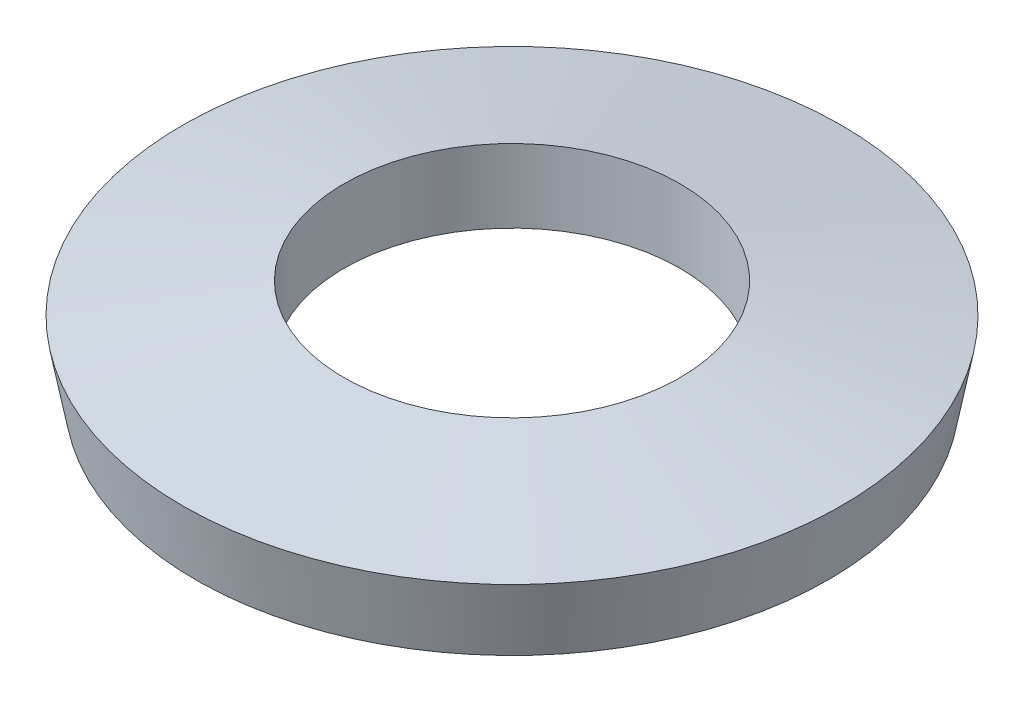
ISO-10303-21;
HEADER;
FILE_DESCRIPTION(('STEP AP214'),'2;1');
FILE_NAME('part.step','',(''),(''),'','','');
FILE_SCHEMA(('AUTOMOTIVE_DESIGN { 1 0 10303 214 1 1 1 1 }'));
ENDSEC;
DATA;
#1=APPLICATION_CONTEXT('core data for automotive mechanical design processes');
#2=APPLICATION_PROTOCOL_DEFINITION('international standard','automotive_design',2000,#1);
#3=PRODUCT_CONTEXT('',#1,'mechanical');
#4=PRODUCT('Part','Part','',(#3));
#5=PRODUCT_RELATED_PRODUCT_CATEGORY('part','',(#4));
#6=PRODUCT_DEFINITION_FORMATION('','',#4);
#7=PRODUCT_DEFINITION_CONTEXT('part definition',#1,'design');
#8=PRODUCT_DEFINITION('design','',#6,#7);
#9=PRODUCT_DEFINITION_SHAPE('','',#8);
#10=(LENGTH_UNIT() NAMED_UNIT(*) SI_UNIT(.MILLI.,.METRE.));
#11=(NAMED_UNIT(*) PLANE_ANGLE_UNIT() SI_UNIT($,.RADIAN.));
#12=(NAMED_UNIT(*) SI_UNIT($,.STERADIAN.) SOLID_ANGLE_UNIT());
#13=UNCERTAINTY_MEASURE_WITH_UNIT(LENGTH_MEASURE(1.E-05),#10,'distance_accuracy_value','');
#14=(GEOMETRIC_REPRESENTATION_CONTEXT(3) GLOBAL_UNCERTAINTY_ASSIGNED_CONTEXT((#13)) GLOBAL_UNIT_ASSIGNED_CONTEXT((#10,
#11,#12)) REPRESENTATION_CONTEXT('',''));
#15=CARTESIAN_POINT('',(0.,0.,0.));
#16=DIRECTION('',(0.,0.,1.));
#17=DIRECTION('',(1.,0.,0.));
#18=AXIS2_PLACEMENT_3D('',#15,#16,#17);
#19=CARTESIAN_POINT('',(36.857793900117,-19.1371426298161,10.4000283791901));
#20=DIRECTION('',(0.,-1.,0.));
#21=DIRECTION('',(0.,0.,-1.));
#22=AXIS2_PLACEMENT_3D('',#19,#20,#21);
#23=CONICAL_SURFACE('',#22,8.0000000000866,1.38627756728708);
#24=CARTESIAN_POINT('',(36.857793900117,-19.1371426298124,10.4000283791901));
#25=DIRECTION('',(0.,1.,0.));
#26=DIRECTION('',(-0.443136015971368,0.,0.896454388883798));
#27=AXIS2_PLACEMENT_3D('',#24,#25,#26);
#28=CIRCLE('',#27,8.);
#29=CARTESIAN_POINT('',(33.3127057723461,-19.1371426298124,17.5716634902605));
#30=VERTEX_POINT('',#29);
#31=EDGE_CURVE('E26',#30,#30,#28,.T.);
#32=ORIENTED_EDGE('',*,*,#31,.F.);
#33=EDGE_LOOP('',(#32));
#34=FACE_BOUND('',#33,.T.);
#35=CARTESIAN_POINT('',(36.857793900117,-18.4371426298124,10.4000283791901));
#36=DIRECTION('',(0.,-1.,0.));
#37=DIRECTION('',(0.,0.,-1.));
#38=AXIS2_PLACEMENT_3D('',#35,#36,#37);
#39=CIRCLE('',#38,4.24950020941952);
#40=CARTESIAN_POINT('',(36.857793900117,-18.4371426298124,6.15052816977059));
#41=VERTEX_POINT('',#40);
#42=EDGE_CURVE('E17',#41,#41,#39,.F.);
#43=ORIENTED_EDGE('',*,*,#42,.T.);
#44=EDGE_LOOP('',(#43));
#45=FACE_BOUND('',#44,.T.);
#46=ADVANCED_FACE('F14',(#34,#45),#23,.F.);
#47=CARTESIAN_POINT('',(36.857793900117,-16.5371426298124,10.4000283791901));
#48=DIRECTION('',(0.,-1.,0.));
#49=DIRECTION('',(0.,0.,-1.));
#50=AXIS2_PLACEMENT_3D('',#47,#48,#49);
#51=CYLINDRICAL_SURFACE('',#50,4.24950020941952);
#52=ORIENTED_EDGE('',*,*,#42,.F.);
#53=EDGE_LOOP('',(#52));
#54=FACE_BOUND('',#53,.T.);
#55=CARTESIAN_POINT('',(36.857793900117,-16.5837097958824,10.4000283791901));
#56=DIRECTION('',(0.,-1.,0.));
#57=DIRECTION('',(0.443136015971368,0.,-0.896454388883798));
#58=AXIS2_PLACEMENT_3D('',#55,#56,#57);
#59=CIRCLE('',#58,4.24950020941953);
#60=CARTESIAN_POINT('',(38.7409004927887,-16.5837097958824,6.59054526589336));
#61=VERTEX_POINT('',#60);
#62=EDGE_CURVE('E21',#61,#61,#59,.T.);
#63=ORIENTED_EDGE('',*,*,#62,.F.);
#64=EDGE_LOOP('',(#63));
#65=FACE_BOUND('',#64,.T.);
#66=ADVANCED_FACE('F35',(#54,#65),#51,.F.);
#67=CARTESIAN_POINT('',(36.857793900117,-17.3461010141588,10.4000283791901));
#68=DIRECTION('',(0.,1.,0.));
#69=DIRECTION('',(0.,0.,1.));
#70=AXIS2_PLACEMENT_3D('',#67,#68,#69);
#71=CONICAL_SURFACE('',#70,8.334283215828,0.184518759509495);
#72=ORIENTED_EDGE('',*,*,#31,.T.);
#73=EDGE_LOOP('',(#72));
#74=FACE_BOUND('',#73,.T.);
#75=CARTESIAN_POINT('',(36.857793900117,-17.3461010141588,10.4000283791901));
#76=DIRECTION('',(0.,-1.,0.));
#77=DIRECTION('',(0.443136015971369,0.,-0.896454388883798));
#78=AXIS2_PLACEMENT_3D('',#75,#76,#77);
#79=CIRCLE('',#78,8.334283215828);
#80=CARTESIAN_POINT('',(40.5510149603561,-17.3461010141588,2.92872361216053));
#81=VERTEX_POINT('',#80);
#82=EDGE_CURVE('E10',#81,#81,#79,.F.);
#83=ORIENTED_EDGE('',*,*,#82,.F.);
#84=EDGE_LOOP('',(#83));
#85=FACE_BOUND('',#84,.T.);
#86=ADVANCED_FACE('F38',(#74,#85),#71,.T.);
#87=CARTESIAN_POINT('',(36.857793900117,-17.3461010141588,10.4000283791901));
#88=DIRECTION('',(0.,-1.,0.));
#89=DIRECTION('',(0.,0.,-1.));
#90=AXIS2_PLACEMENT_3D('',#87,#88,#89);
#91=CONICAL_SURFACE('',#90,8.33428321582803,1.3862775672854);
#92=ORIENTED_EDGE('',*,*,#62,.T.);
#93=EDGE_LOOP('',(#92));
#94=FACE_BOUND('',#93,.T.);
#95=ORIENTED_EDGE('',*,*,#82,.T.);
#96=EDGE_LOOP('',(#95));
#97=FACE_BOUND('',#96,.T.);
#98=ADVANCED_FACE('F41',(#94,#97),#91,.T.);
#99=CLOSED_SHELL('',(#46,#66,#86,#98));
#100=MANIFOLD_SOLID_BREP('B1',#99);
#101=ADVANCED_BREP_SHAPE_REPRESENTATION('',(#18,#100),#14);
#102=SHAPE_DEFINITION_REPRESENTATION(#9,#101);
ENDSEC;
END-ISO-10303-21;
